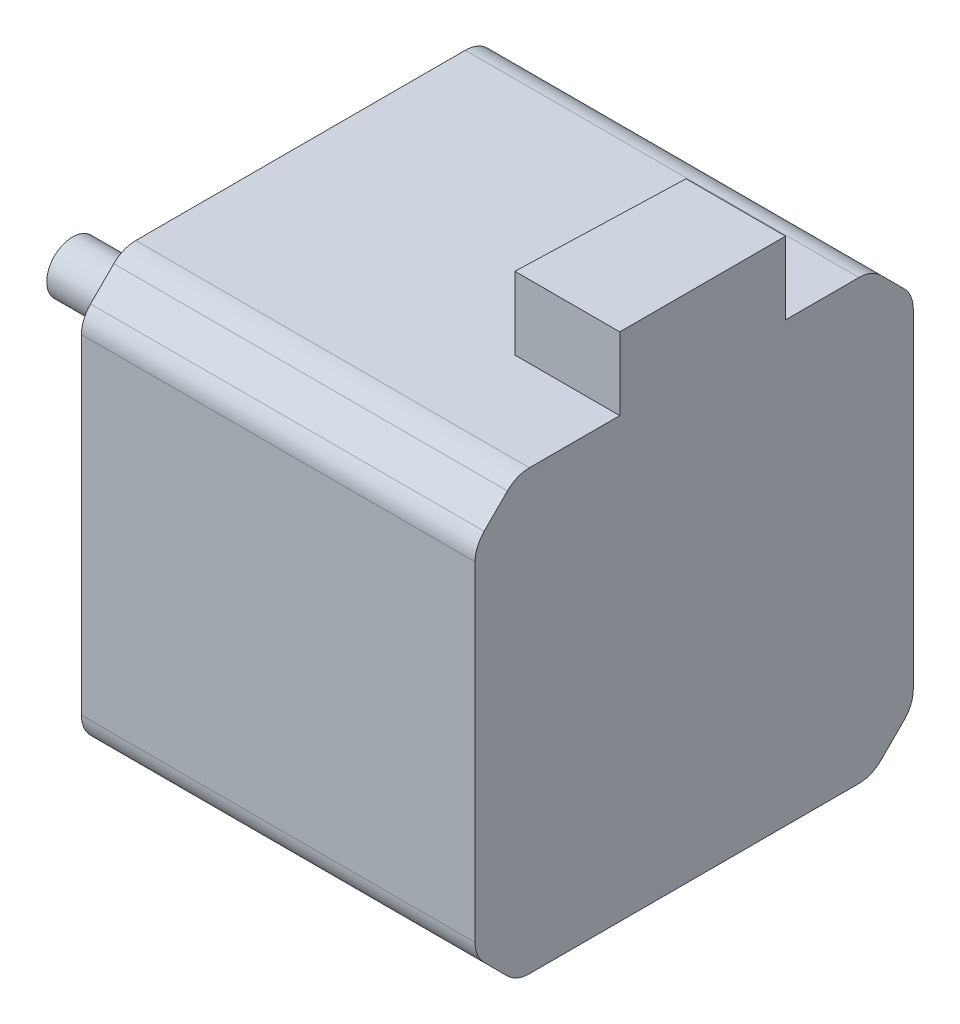
ISO-10303-21;
HEADER;
FILE_DESCRIPTION(('STEP AP214'),'2;1');
FILE_NAME('part.step','',(''),(''),'','','');
FILE_SCHEMA(('AUTOMOTIVE_DESIGN { 1 0 10303 214 1 1 1 1 }'));
ENDSEC;
DATA;
#1=APPLICATION_CONTEXT('core data for automotive mechanical design processes');
#2=APPLICATION_PROTOCOL_DEFINITION('international standard','automotive_design',2000,#1);
#3=PRODUCT_CONTEXT('',#1,'mechanical');
#4=PRODUCT('Part','Part','',(#3));
#5=PRODUCT_RELATED_PRODUCT_CATEGORY('part','',(#4));
#6=PRODUCT_DEFINITION_FORMATION('','',#4);
#7=PRODUCT_DEFINITION_CONTEXT('part definition',#1,'design');
#8=PRODUCT_DEFINITION('design','',#6,#7);
#9=PRODUCT_DEFINITION_SHAPE('','',#8);
#10=(LENGTH_UNIT() NAMED_UNIT(*) SI_UNIT(.MILLI.,.METRE.));
#11=(NAMED_UNIT(*) PLANE_ANGLE_UNIT() SI_UNIT($,.RADIAN.));
#12=(NAMED_UNIT(*) SI_UNIT($,.STERADIAN.) SOLID_ANGLE_UNIT());
#13=UNCERTAINTY_MEASURE_WITH_UNIT(LENGTH_MEASURE(1.E-05),#10,'distance_accuracy_value','');
#14=(GEOMETRIC_REPRESENTATION_CONTEXT(3) GLOBAL_UNCERTAINTY_ASSIGNED_CONTEXT((#13)) GLOBAL_UNIT_ASSIGNED_CONTEXT((#10,
#11,#12)) REPRESENTATION_CONTEXT('',''));
#15=CARTESIAN_POINT('',(0.,0.,0.));
#16=DIRECTION('',(0.,0.,1.));
#17=DIRECTION('',(1.,0.,0.));
#18=AXIS2_PLACEMENT_3D('',#15,#16,#17);
#19=CARTESIAN_POINT('',(38.,42.3,-5.2426406871193));
#20=DIRECTION('',(0.,1.,0.));
#21=DIRECTION('',(0.,0.,1.));
#22=AXIS2_PLACEMENT_3D('',#19,#20,#21);
#23=PLANE('',#22);
#24=DIRECTION('',(-0.032942464499696,0.,0.999457249727414));
#25=VECTOR('',#24,1.);
#26=CARTESIAN_POINT('',(28.4,42.3,-29.967521896495));
#27=LINE('',#26,#25);
#28=CARTESIAN_POINT('',(28.4,42.3,-29.967521896495));
#29=VERTEX_POINT('',#28);
#30=CARTESIAN_POINT('',(27.8726343401492,42.3,-13.967521896495));
#31=VERTEX_POINT('',#30);
#32=EDGE_CURVE('E51',#29,#31,#27,.T.);
#33=ORIENTED_EDGE('',*,*,#32,.F.);
#34=DIRECTION('',(-1.,0.,0.));
#35=VECTOR('',#34,1.);
#36=CARTESIAN_POINT('',(28.4,42.3,-29.967521896495));
#37=LINE('',#36,#35);
#38=CARTESIAN_POINT('',(38.,42.3,-29.967521896495));
#39=VERTEX_POINT('',#38);
#40=EDGE_CURVE('E708',#39,#29,#37,.T.);
#41=ORIENTED_EDGE('',*,*,#40,.F.);
#42=DIRECTION('',(0.,0.,-1.));
#43=VECTOR('',#42,1.);
#44=CARTESIAN_POINT('',(38.,42.3,-5.2426406871193));
#45=LINE('',#44,#43);
#46=CARTESIAN_POINT('',(38.,42.3,-37.0573593128807));
#47=VERTEX_POINT('',#46);
#48=EDGE_CURVE('E195',#39,#47,#45,.T.);
#49=ORIENTED_EDGE('',*,*,#48,.T.);
#50=DIRECTION('',(-1.,0.,0.));
#51=VECTOR('',#50,1.);
#52=CARTESIAN_POINT('',(38.,42.3,-37.0573593128807));
#53=LINE('',#52,#51);
#54=CARTESIAN_POINT('',(0.,42.3,-37.0573593128807));
#55=VERTEX_POINT('',#54);
#56=EDGE_CURVE('E350',#47,#55,#53,.T.);
#57=ORIENTED_EDGE('',*,*,#56,.T.);
#58=DIRECTION('',(0.,0.,-1.));
#59=VECTOR('',#58,1.);
#60=CARTESIAN_POINT('',(0.,42.3,-5.2426406871193));
#61=LINE('',#60,#59);
#62=CARTESIAN_POINT('',(0.,42.3,-5.2426406871193));
#63=VERTEX_POINT('',#62);
#64=EDGE_CURVE('E278',#63,#55,#61,.T.);
#65=ORIENTED_EDGE('',*,*,#64,.F.);
#66=DIRECTION('',(-1.,0.,0.));
#67=VECTOR('',#66,1.);
#68=CARTESIAN_POINT('',(38.,42.3,-5.2426406871193));
#69=LINE('',#68,#67);
#70=CARTESIAN_POINT('',(38.,42.3,-5.2426406871193));
#71=VERTEX_POINT('',#70);
#72=EDGE_CURVE('E275',#71,#63,#69,.T.);
#73=ORIENTED_EDGE('',*,*,#72,.F.);
#74=CARTESIAN_POINT('',(38.,42.3,-13.967521896495));
#75=VERTEX_POINT('',#74);
#76=EDGE_CURVE('E239',#71,#75,#45,.T.);
#77=ORIENTED_EDGE('',*,*,#76,.T.);
#78=DIRECTION('',(1.,0.,0.));
#79=VECTOR('',#78,1.);
#80=CARTESIAN_POINT('',(38.,42.3,-13.967521896495));
#81=LINE('',#80,#79);
#82=EDGE_CURVE('E56',#31,#75,#81,.T.);
#83=ORIENTED_EDGE('',*,*,#82,.F.);
#84=EDGE_LOOP('',(#33,#41,#49,#57,#65,#73,#77,#83));
#85=FACE_BOUND('',#84,.T.);
#86=ADVANCED_FACE('F36',(#85),#23,.T.);
#87=CARTESIAN_POINT('',(38.,39.3,-5.24264068711928));
#88=DIRECTION('',(-1.,0.,0.));
#89=DIRECTION('',(0.,0.,1.));
#90=AXIS2_PLACEMENT_3D('',#87,#88,#89);
#91=CYLINDRICAL_SURFACE('',#90,3.);
#92=CARTESIAN_POINT('',(0.,39.3,-5.24264068711928));
#93=DIRECTION('',(-1.,0.,0.));
#94=DIRECTION('',(0.,0.,1.));
#95=AXIS2_PLACEMENT_3D('',#92,#93,#94);
#96=CIRCLE('',#95,3.);
#97=CARTESIAN_POINT('',(0.,41.4213203435596,-3.12132034355963));
#98=VERTEX_POINT('',#97);
#99=EDGE_CURVE('E234',#98,#63,#96,.T.);
#100=ORIENTED_EDGE('',*,*,#99,.F.);
#101=DIRECTION('',(-1.,0.,0.));
#102=VECTOR('',#101,1.);
#103=CARTESIAN_POINT('',(38.,41.4213203435596,-3.12132034355963));
#104=LINE('',#103,#102);
#105=CARTESIAN_POINT('',(38.,41.4213203435596,-3.12132034355963));
#106=VERTEX_POINT('',#105);
#107=EDGE_CURVE('E318',#106,#98,#104,.T.);
#108=ORIENTED_EDGE('',*,*,#107,.F.);
#109=CARTESIAN_POINT('',(38.,39.3,-5.24264068711928));
#110=DIRECTION('',(-1.,0.,0.));
#111=DIRECTION('',(0.,0.,1.));
#112=AXIS2_PLACEMENT_3D('',#109,#110,#111);
#113=CIRCLE('',#112,3.);
#114=EDGE_CURVE('E235',#106,#71,#113,.T.);
#115=ORIENTED_EDGE('',*,*,#114,.T.);
#116=ORIENTED_EDGE('',*,*,#72,.T.);
#117=EDGE_LOOP('',(#100,#108,#115,#116));
#118=FACE_BOUND('',#117,.T.);
#119=ADVANCED_FACE('F372',(#118),#91,.T.);
#120=CARTESIAN_POINT('',(38.,39.1786796564404,-0.878679656440368));
#121=DIRECTION('',(0.,0.707106781186548,0.707106781186547));
#122=DIRECTION('',(0.,-0.707106781186547,0.707106781186548));
#123=AXIS2_PLACEMENT_3D('',#120,#121,#122);
#124=PLANE('',#123);
#125=DIRECTION('',(0.,0.707106781186547,-0.707106781186548));
#126=VECTOR('',#125,1.);
#127=CARTESIAN_POINT('',(0.,39.1786796564404,-0.878679656440368));
#128=LINE('',#127,#126);
#129=CARTESIAN_POINT('',(0.,39.1786796564404,-0.878679656440369));
#130=VERTEX_POINT('',#129);
#131=EDGE_CURVE('E238',#130,#98,#128,.T.);
#132=ORIENTED_EDGE('',*,*,#131,.F.);
#133=DIRECTION('',(-1.,0.,0.));
#134=VECTOR('',#133,1.);
#135=CARTESIAN_POINT('',(38.,39.1786796564404,-0.878679656440369));
#136=LINE('',#135,#134);
#137=CARTESIAN_POINT('',(38.,39.1786796564404,-0.878679656440369));
#138=VERTEX_POINT('',#137);
#139=EDGE_CURVE('E320',#138,#130,#136,.T.);
#140=ORIENTED_EDGE('',*,*,#139,.F.);
#141=DIRECTION('',(0.,0.707106781186547,-0.707106781186548));
#142=VECTOR('',#141,1.);
#143=CARTESIAN_POINT('',(38.,39.1786796564404,-0.878679656440368));
#144=LINE('',#143,#142);
#145=EDGE_CURVE('E272',#138,#106,#144,.T.);
#146=ORIENTED_EDGE('',*,*,#145,.T.);
#147=ORIENTED_EDGE('',*,*,#107,.T.);
#148=EDGE_LOOP('',(#132,#140,#146,#147));
#149=FACE_BOUND('',#148,.T.);
#150=ADVANCED_FACE('F377',(#149),#124,.T.);
#151=CARTESIAN_POINT('',(38.,37.0573593128807,-3.));
#152=DIRECTION('',(-1.,0.,0.));
#153=DIRECTION('',(0.,0.,1.));
#154=AXIS2_PLACEMENT_3D('',#151,#152,#153);
#155=CYLINDRICAL_SURFACE('',#154,3.);
#156=CARTESIAN_POINT('',(0.,37.0573593128807,-3.));
#157=DIRECTION('',(1.,0.,0.));
#158=DIRECTION('',(0.,0.,-1.));
#159=AXIS2_PLACEMENT_3D('',#156,#157,#158);
#160=CIRCLE('',#159,3.);
#161=CARTESIAN_POINT('',(0.,37.0573593128807,0.));
#162=VERTEX_POINT('',#161);
#163=EDGE_CURVE('E313',#130,#162,#160,.T.);
#164=ORIENTED_EDGE('',*,*,#163,.T.);
#165=DIRECTION('',(-1.,0.,0.));
#166=VECTOR('',#165,1.);
#167=CARTESIAN_POINT('',(38.,37.0573593128807,0.));
#168=LINE('',#167,#166);
#169=CARTESIAN_POINT('',(38.,37.0573593128807,0.));
#170=VERTEX_POINT('',#169);
#171=EDGE_CURVE('E322',#170,#162,#168,.T.);
#172=ORIENTED_EDGE('',*,*,#171,.F.);
#173=CARTESIAN_POINT('',(38.,37.0573593128807,-3.));
#174=DIRECTION('',(1.,0.,0.));
#175=DIRECTION('',(0.,0.,-1.));
#176=AXIS2_PLACEMENT_3D('',#173,#174,#175);
#177=CIRCLE('',#176,3.);
#178=EDGE_CURVE('E270',#138,#170,#177,.T.);
#179=ORIENTED_EDGE('',*,*,#178,.F.);
#180=ORIENTED_EDGE('',*,*,#139,.T.);
#181=EDGE_LOOP('',(#164,#172,#179,#180));
#182=FACE_BOUND('',#181,.T.);
#183=ADVANCED_FACE('F427',(#182),#155,.T.);
#184=CARTESIAN_POINT('',(38.,5.2426406871193,0.));
#185=DIRECTION('',(0.,0.,1.));
#186=DIRECTION('',(1.,0.,0.));
#187=AXIS2_PLACEMENT_3D('',#184,#185,#186);
#188=PLANE('',#187);
#189=DIRECTION('',(0.,1.,0.));
#190=VECTOR('',#189,1.);
#191=CARTESIAN_POINT('',(0.,5.2426406871193,0.));
#192=LINE('',#191,#190);
#193=CARTESIAN_POINT('',(0.,5.24264068711928,0.));
#194=VERTEX_POINT('',#193);
#195=EDGE_CURVE('E310',#194,#162,#192,.T.);
#196=ORIENTED_EDGE('',*,*,#195,.F.);
#197=DIRECTION('',(-1.,0.,0.));
#198=VECTOR('',#197,1.);
#199=CARTESIAN_POINT('',(38.,5.24264068711928,0.));
#200=LINE('',#199,#198);
#201=CARTESIAN_POINT('',(38.,5.24264068711928,0.));
#202=VERTEX_POINT('',#201);
#203=EDGE_CURVE('E324',#202,#194,#200,.T.);
#204=ORIENTED_EDGE('',*,*,#203,.F.);
#205=DIRECTION('',(0.,1.,0.));
#206=VECTOR('',#205,1.);
#207=CARTESIAN_POINT('',(38.,5.2426406871193,0.));
#208=LINE('',#207,#206);
#209=EDGE_CURVE('E267',#202,#170,#208,.T.);
#210=ORIENTED_EDGE('',*,*,#209,.T.);
#211=ORIENTED_EDGE('',*,*,#171,.T.);
#212=EDGE_LOOP('',(#196,#204,#210,#211));
#213=FACE_BOUND('',#212,.T.);
#214=ADVANCED_FACE('F423',(#213),#188,.T.);
#215=CARTESIAN_POINT('',(38.,5.24264068711928,-3.));
#216=DIRECTION('',(-1.,0.,0.));
#217=DIRECTION('',(0.,0.,1.));
#218=AXIS2_PLACEMENT_3D('',#215,#216,#217);
#219=CYLINDRICAL_SURFACE('',#218,3.);
#220=CARTESIAN_POINT('',(0.,5.24264068711928,-3.));
#221=DIRECTION('',(-1.,0.,0.));
#222=DIRECTION('',(0.,0.,1.));
#223=AXIS2_PLACEMENT_3D('',#220,#221,#222);
#224=CIRCLE('',#223,3.);
#225=CARTESIAN_POINT('',(0.,3.12132034355963,-0.878679656440366));
#226=VERTEX_POINT('',#225);
#227=EDGE_CURVE('E307',#226,#194,#224,.T.);
#228=ORIENTED_EDGE('',*,*,#227,.F.);
#229=DIRECTION('',(-1.,0.,0.));
#230=VECTOR('',#229,1.);
#231=CARTESIAN_POINT('',(38.,3.12132034355963,-0.878679656440366));
#232=LINE('',#231,#230);
#233=CARTESIAN_POINT('',(38.,3.12132034355963,-0.878679656440366));
#234=VERTEX_POINT('',#233);
#235=EDGE_CURVE('E326',#234,#226,#232,.T.);
#236=ORIENTED_EDGE('',*,*,#235,.F.);
#237=CARTESIAN_POINT('',(38.,5.24264068711928,-3.));
#238=DIRECTION('',(-1.,0.,0.));
#239=DIRECTION('',(0.,0.,1.));
#240=AXIS2_PLACEMENT_3D('',#237,#238,#239);
#241=CIRCLE('',#240,3.);
#242=EDGE_CURVE('E264',#234,#202,#241,.T.);
#243=ORIENTED_EDGE('',*,*,#242,.T.);
#244=ORIENTED_EDGE('',*,*,#203,.T.);
#245=EDGE_LOOP('',(#228,#236,#243,#244));
#246=FACE_BOUND('',#245,.T.);
#247=ADVANCED_FACE('F419',(#246),#219,.T.);
#248=CARTESIAN_POINT('',(38.,3.12132034355963,-0.878679656440366));
#249=DIRECTION('',(0.,0.707106781186548,-0.707106781186548));
#250=DIRECTION('',(0.,0.707106781186548,0.707106781186548));
#251=AXIS2_PLACEMENT_3D('',#248,#249,#250);
#252=PLANE('',#251);
#253=DIRECTION('',(0.,-0.707106781186547,-0.707106781186547));
#254=VECTOR('',#253,1.);
#255=CARTESIAN_POINT('',(0.,3.12132034355963,-0.878679656440366));
#256=LINE('',#255,#254);
#257=CARTESIAN_POINT('',(0.,0.878679656440366,-3.12132034355963));
#258=VERTEX_POINT('',#257);
#259=EDGE_CURVE('E305',#226,#258,#256,.T.);
#260=ORIENTED_EDGE('',*,*,#259,.T.);
#261=DIRECTION('',(-1.,0.,0.));
#262=VECTOR('',#261,1.);
#263=CARTESIAN_POINT('',(38.,0.878679656440366,-3.12132034355963));
#264=LINE('',#263,#262);
#265=CARTESIAN_POINT('',(38.,0.878679656440366,-3.12132034355963));
#266=VERTEX_POINT('',#265);
#267=EDGE_CURVE('E328',#266,#258,#264,.T.);
#268=ORIENTED_EDGE('',*,*,#267,.F.);
#269=DIRECTION('',(0.,-0.707106781186547,-0.707106781186547));
#270=VECTOR('',#269,1.);
#271=CARTESIAN_POINT('',(38.,3.12132034355963,-0.878679656440366));
#272=LINE('',#271,#270);
#273=EDGE_CURVE('E262',#234,#266,#272,.T.);
#274=ORIENTED_EDGE('',*,*,#273,.F.);
#275=ORIENTED_EDGE('',*,*,#235,.T.);
#276=EDGE_LOOP('',(#260,#268,#274,#275));
#277=FACE_BOUND('',#276,.T.);
#278=ADVANCED_FACE('F415',(#277),#252,.F.);
#279=CARTESIAN_POINT('',(38.,3.,-5.24264068711928));
#280=DIRECTION('',(-1.,0.,0.));
#281=DIRECTION('',(0.,0.,1.));
#282=AXIS2_PLACEMENT_3D('',#279,#280,#281);
#283=CYLINDRICAL_SURFACE('',#282,3.);
#284=CARTESIAN_POINT('',(0.,3.,-5.24264068711928));
#285=DIRECTION('',(1.,0.,0.));
#286=DIRECTION('',(0.,0.,-1.));
#287=AXIS2_PLACEMENT_3D('',#284,#285,#286);
#288=CIRCLE('',#287,3.);
#289=CARTESIAN_POINT('',(0.,0.,-5.2426406871193));
#290=VERTEX_POINT('',#289);
#291=EDGE_CURVE('E303',#258,#290,#288,.T.);
#292=ORIENTED_EDGE('',*,*,#291,.T.);
#293=DIRECTION('',(-1.,0.,0.));
#294=VECTOR('',#293,1.);
#295=CARTESIAN_POINT('',(38.,0.,-5.2426406871193));
#296=LINE('',#295,#294);
#297=CARTESIAN_POINT('',(38.,0.,-5.2426406871193));
#298=VERTEX_POINT('',#297);
#299=EDGE_CURVE('E331',#298,#290,#296,.T.);
#300=ORIENTED_EDGE('',*,*,#299,.F.);
#301=CARTESIAN_POINT('',(38.,3.,-5.24264068711928));
#302=DIRECTION('',(1.,0.,0.));
#303=DIRECTION('',(0.,0.,-1.));
#304=AXIS2_PLACEMENT_3D('',#301,#302,#303);
#305=CIRCLE('',#304,3.);
#306=EDGE_CURVE('E260',#266,#298,#305,.T.);
#307=ORIENTED_EDGE('',*,*,#306,.F.);
#308=ORIENTED_EDGE('',*,*,#267,.T.);
#309=EDGE_LOOP('',(#292,#300,#307,#308));
#310=FACE_BOUND('',#309,.T.);
#311=ADVANCED_FACE('F411',(#310),#283,.T.);
#312=CARTESIAN_POINT('',(38.,0.,-5.2426406871193));
#313=DIRECTION('',(0.,1.,0.));
#314=DIRECTION('',(0.,0.,1.));
#315=AXIS2_PLACEMENT_3D('',#312,#313,#314);
#316=PLANE('',#315);
#317=DIRECTION('',(0.,0.,-1.));
#318=VECTOR('',#317,1.);
#319=CARTESIAN_POINT('',(0.,0.,-5.2426406871193));
#320=LINE('',#319,#318);
#321=CARTESIAN_POINT('',(0.,0.,-37.0573593128807));
#322=VERTEX_POINT('',#321);
#323=EDGE_CURVE('E300',#290,#322,#320,.T.);
#324=ORIENTED_EDGE('',*,*,#323,.T.);
#325=DIRECTION('',(-1.,0.,0.));
#326=VECTOR('',#325,1.);
#327=CARTESIAN_POINT('',(38.,0.,-37.0573593128807));
#328=LINE('',#327,#326);
#329=CARTESIAN_POINT('',(38.,0.,-37.0573593128807));
#330=VERTEX_POINT('',#329);
#331=EDGE_CURVE('E334',#330,#322,#328,.T.);
#332=ORIENTED_EDGE('',*,*,#331,.F.);
#333=DIRECTION('',(0.,0.,-1.));
#334=VECTOR('',#333,1.);
#335=CARTESIAN_POINT('',(38.,0.,-5.2426406871193));
#336=LINE('',#335,#334);
#337=EDGE_CURVE('E258',#298,#330,#336,.T.);
#338=ORIENTED_EDGE('',*,*,#337,.F.);
#339=ORIENTED_EDGE('',*,*,#299,.T.);
#340=EDGE_LOOP('',(#324,#332,#338,#339));
#341=FACE_BOUND('',#340,.T.);
#342=ADVANCED_FACE('F407',(#341),#316,.F.);
#343=CARTESIAN_POINT('',(38.,3.,-37.0573593128807));
#344=DIRECTION('',(-1.,0.,0.));
#345=DIRECTION('',(0.,0.,1.));
#346=AXIS2_PLACEMENT_3D('',#343,#344,#345);
#347=CYLINDRICAL_SURFACE('',#346,3.);
#348=CARTESIAN_POINT('',(0.,3.,-37.0573593128807));
#349=DIRECTION('',(-1.,0.,0.));
#350=DIRECTION('',(0.,0.,1.));
#351=AXIS2_PLACEMENT_3D('',#348,#349,#350);
#352=CIRCLE('',#351,3.);
#353=CARTESIAN_POINT('',(0.,0.878679656440368,-39.1786796564404));
#354=VERTEX_POINT('',#353);
#355=EDGE_CURVE('E297',#354,#322,#352,.T.);
#356=ORIENTED_EDGE('',*,*,#355,.F.);
#357=DIRECTION('',(-1.,0.,0.));
#358=VECTOR('',#357,1.);
#359=CARTESIAN_POINT('',(38.,0.878679656440368,-39.1786796564404));
#360=LINE('',#359,#358);
#361=CARTESIAN_POINT('',(38.,0.878679656440368,-39.1786796564404));
#362=VERTEX_POINT('',#361);
#363=EDGE_CURVE('E336',#362,#354,#360,.T.);
#364=ORIENTED_EDGE('',*,*,#363,.F.);
#365=CARTESIAN_POINT('',(38.,3.,-37.0573593128807));
#366=DIRECTION('',(-1.,0.,0.));
#367=DIRECTION('',(0.,0.,1.));
#368=AXIS2_PLACEMENT_3D('',#365,#366,#367);
#369=CIRCLE('',#368,3.);
#370=EDGE_CURVE('E255',#362,#330,#369,.T.);
#371=ORIENTED_EDGE('',*,*,#370,.T.);
#372=ORIENTED_EDGE('',*,*,#331,.T.);
#373=EDGE_LOOP('',(#356,#364,#371,#372));
#374=FACE_BOUND('',#373,.T.);
#375=ADVANCED_FACE('F403',(#374),#347,.T.);
#376=CARTESIAN_POINT('',(38.,0.878679656440368,-39.1786796564404));
#377=DIRECTION('',(0.,0.707106781186547,0.707106781186548));
#378=DIRECTION('',(0.,-0.707106781186548,0.707106781186547));
#379=AXIS2_PLACEMENT_3D('',#376,#377,#378);
#380=PLANE('',#379);
#381=DIRECTION('',(0.,0.707106781186548,-0.707106781186547));
#382=VECTOR('',#381,1.);
#383=CARTESIAN_POINT('',(0.,0.878679656440368,-39.1786796564404));
#384=LINE('',#383,#382);
#385=CARTESIAN_POINT('',(0.,3.12132034355963,-41.4213203435596));
#386=VERTEX_POINT('',#385);
#387=EDGE_CURVE('E295',#354,#386,#384,.T.);
#388=ORIENTED_EDGE('',*,*,#387,.T.);
#389=DIRECTION('',(-1.,0.,0.));
#390=VECTOR('',#389,1.);
#391=CARTESIAN_POINT('',(38.,3.12132034355963,-41.4213203435596));
#392=LINE('',#391,#390);
#393=CARTESIAN_POINT('',(38.,3.12132034355963,-41.4213203435596));
#394=VERTEX_POINT('',#393);
#395=EDGE_CURVE('E338',#394,#386,#392,.T.);
#396=ORIENTED_EDGE('',*,*,#395,.F.);
#397=DIRECTION('',(0.,0.707106781186548,-0.707106781186547));
#398=VECTOR('',#397,1.);
#399=CARTESIAN_POINT('',(38.,0.878679656440368,-39.1786796564404));
#400=LINE('',#399,#398);
#401=EDGE_CURVE('E253',#362,#394,#400,.T.);
#402=ORIENTED_EDGE('',*,*,#401,.F.);
#403=ORIENTED_EDGE('',*,*,#363,.T.);
#404=EDGE_LOOP('',(#388,#396,#402,#403));
#405=FACE_BOUND('',#404,.T.);
#406=ADVANCED_FACE('F399',(#405),#380,.F.);
#407=CARTESIAN_POINT('',(38.,5.24264068711928,-39.3));
#408=DIRECTION('',(-1.,0.,0.));
#409=DIRECTION('',(0.,0.,1.));
#410=AXIS2_PLACEMENT_3D('',#407,#408,#409);
#411=CYLINDRICAL_SURFACE('',#410,3.);
#412=CARTESIAN_POINT('',(0.,5.24264068711928,-39.3));
#413=DIRECTION('',(1.,0.,0.));
#414=DIRECTION('',(0.,0.,-1.));
#415=AXIS2_PLACEMENT_3D('',#412,#413,#414);
#416=CIRCLE('',#415,3.);
#417=CARTESIAN_POINT('',(0.,5.2426406871193,-42.3));
#418=VERTEX_POINT('',#417);
#419=EDGE_CURVE('E293',#386,#418,#416,.T.);
#420=ORIENTED_EDGE('',*,*,#419,.T.);
#421=DIRECTION('',(-1.,0.,0.));
#422=VECTOR('',#421,1.);
#423=CARTESIAN_POINT('',(38.,5.2426406871193,-42.3));
#424=LINE('',#423,#422);
#425=CARTESIAN_POINT('',(38.,5.2426406871193,-42.3));
#426=VERTEX_POINT('',#425);
#427=EDGE_CURVE('E341',#426,#418,#424,.T.);
#428=ORIENTED_EDGE('',*,*,#427,.F.);
#429=CARTESIAN_POINT('',(38.,5.24264068711928,-39.3));
#430=DIRECTION('',(1.,0.,0.));
#431=DIRECTION('',(0.,0.,-1.));
#432=AXIS2_PLACEMENT_3D('',#429,#430,#431);
#433=CIRCLE('',#432,3.);
#434=EDGE_CURVE('E251',#394,#426,#433,.T.);
#435=ORIENTED_EDGE('',*,*,#434,.F.);
#436=ORIENTED_EDGE('',*,*,#395,.T.);
#437=EDGE_LOOP('',(#420,#428,#435,#436));
#438=FACE_BOUND('',#437,.T.);
#439=ADVANCED_FACE('F395',(#438),#411,.T.);
#440=CARTESIAN_POINT('',(38.,5.2426406871193,-42.3));
#441=DIRECTION('',(0.,0.,1.));
#442=DIRECTION('',(1.,0.,0.));
#443=AXIS2_PLACEMENT_3D('',#440,#441,#442);
#444=PLANE('',#443);
#445=DIRECTION('',(0.,1.,0.));
#446=VECTOR('',#445,1.);
#447=CARTESIAN_POINT('',(0.,5.2426406871193,-42.3));
#448=LINE('',#447,#446);
#449=CARTESIAN_POINT('',(0.,37.0573593128807,-42.3));
#450=VERTEX_POINT('',#449);
#451=EDGE_CURVE('E290',#418,#450,#448,.T.);
#452=ORIENTED_EDGE('',*,*,#451,.T.);
#453=DIRECTION('',(-1.,0.,0.));
#454=VECTOR('',#453,1.);
#455=CARTESIAN_POINT('',(38.,37.0573593128807,-42.3));
#456=LINE('',#455,#454);
#457=CARTESIAN_POINT('',(38.,37.0573593128807,-42.3));
#458=VERTEX_POINT('',#457);
#459=EDGE_CURVE('E344',#458,#450,#456,.T.);
#460=ORIENTED_EDGE('',*,*,#459,.F.);
#461=DIRECTION('',(0.,1.,0.));
#462=VECTOR('',#461,1.);
#463=CARTESIAN_POINT('',(38.,5.2426406871193,-42.3));
#464=LINE('',#463,#462);
#465=EDGE_CURVE('E249',#426,#458,#464,.T.);
#466=ORIENTED_EDGE('',*,*,#465,.F.);
#467=ORIENTED_EDGE('',*,*,#427,.T.);
#468=EDGE_LOOP('',(#452,#460,#466,#467));
#469=FACE_BOUND('',#468,.T.);
#470=ADVANCED_FACE('F391',(#469),#444,.F.);
#471=CARTESIAN_POINT('',(38.,37.0573593128807,-39.3));
#472=DIRECTION('',(-1.,0.,0.));
#473=DIRECTION('',(0.,0.,1.));
#474=AXIS2_PLACEMENT_3D('',#471,#472,#473);
#475=CYLINDRICAL_SURFACE('',#474,3.);
#476=CARTESIAN_POINT('',(0.,37.0573593128807,-39.3));
#477=DIRECTION('',(-1.,0.,0.));
#478=DIRECTION('',(0.,0.,1.));
#479=AXIS2_PLACEMENT_3D('',#476,#477,#478);
#480=CIRCLE('',#479,3.);
#481=CARTESIAN_POINT('',(0.,39.1786796564404,-41.4213203435596));
#482=VERTEX_POINT('',#481);
#483=EDGE_CURVE('E287',#482,#450,#480,.T.);
#484=ORIENTED_EDGE('',*,*,#483,.F.);
#485=DIRECTION('',(-1.,0.,0.));
#486=VECTOR('',#485,1.);
#487=CARTESIAN_POINT('',(38.,39.1786796564404,-41.4213203435596));
#488=LINE('',#487,#486);
#489=CARTESIAN_POINT('',(38.,39.1786796564404,-41.4213203435596));
#490=VERTEX_POINT('',#489);
#491=EDGE_CURVE('E346',#490,#482,#488,.T.);
#492=ORIENTED_EDGE('',*,*,#491,.F.);
#493=CARTESIAN_POINT('',(38.,37.0573593128807,-39.3));
#494=DIRECTION('',(-1.,0.,0.));
#495=DIRECTION('',(0.,0.,1.));
#496=AXIS2_PLACEMENT_3D('',#493,#494,#495);
#497=CIRCLE('',#496,3.);
#498=EDGE_CURVE('E246',#490,#458,#497,.T.);
#499=ORIENTED_EDGE('',*,*,#498,.T.);
#500=ORIENTED_EDGE('',*,*,#459,.T.);
#501=EDGE_LOOP('',(#484,#492,#499,#500));
#502=FACE_BOUND('',#501,.T.);
#503=ADVANCED_FACE('F387',(#502),#475,.T.);
#504=CARTESIAN_POINT('',(38.,41.4213203435596,-39.1786796564404));
#505=DIRECTION('',(0.,0.707106781186548,-0.707106781186548));
#506=DIRECTION('',(0.,0.707106781186548,0.707106781186548));
#507=AXIS2_PLACEMENT_3D('',#504,#505,#506);
#508=PLANE('',#507);
#509=DIRECTION('',(0.,-0.707106781186547,-0.707106781186547));
#510=VECTOR('',#509,1.);
#511=CARTESIAN_POINT('',(0.,41.4213203435596,-39.1786796564404));
#512=LINE('',#511,#510);
#513=CARTESIAN_POINT('',(0.,41.4213203435596,-39.1786796564404));
#514=VERTEX_POINT('',#513);
#515=EDGE_CURVE('E284',#514,#482,#512,.T.);
#516=ORIENTED_EDGE('',*,*,#515,.F.);
#517=DIRECTION('',(-1.,0.,0.));
#518=VECTOR('',#517,1.);
#519=CARTESIAN_POINT('',(38.,41.4213203435596,-39.1786796564404));
#520=LINE('',#519,#518);
#521=CARTESIAN_POINT('',(38.,41.4213203435596,-39.1786796564404));
#522=VERTEX_POINT('',#521);
#523=EDGE_CURVE('E348',#522,#514,#520,.T.);
#524=ORIENTED_EDGE('',*,*,#523,.F.);
#525=DIRECTION('',(0.,-0.707106781186547,-0.707106781186547));
#526=VECTOR('',#525,1.);
#527=CARTESIAN_POINT('',(38.,41.4213203435596,-39.1786796564404));
#528=LINE('',#527,#526);
#529=EDGE_CURVE('E243',#522,#490,#528,.T.);
#530=ORIENTED_EDGE('',*,*,#529,.T.);
#531=ORIENTED_EDGE('',*,*,#491,.T.);
#532=EDGE_LOOP('',(#516,#524,#530,#531));
#533=FACE_BOUND('',#532,.T.);
#534=ADVANCED_FACE('F383',(#533),#508,.T.);
#535=CARTESIAN_POINT('',(38.,39.3,-37.0573593128807));
#536=DIRECTION('',(-1.,0.,0.));
#537=DIRECTION('',(0.,0.,1.));
#538=AXIS2_PLACEMENT_3D('',#535,#536,#537);
#539=CYLINDRICAL_SURFACE('',#538,3.);
#540=CARTESIAN_POINT('',(0.,39.3,-37.0573593128807));
#541=DIRECTION('',(1.,0.,0.));
#542=DIRECTION('',(0.,0.,-1.));
#543=AXIS2_PLACEMENT_3D('',#540,#541,#542);
#544=CIRCLE('',#543,3.);
#545=EDGE_CURVE('E281',#514,#55,#544,.T.);
#546=ORIENTED_EDGE('',*,*,#545,.T.);
#547=ORIENTED_EDGE('',*,*,#56,.F.);
#548=CARTESIAN_POINT('',(38.,39.3,-37.0573593128807));
#549=DIRECTION('',(1.,0.,0.));
#550=DIRECTION('',(0.,0.,-1.));
#551=AXIS2_PLACEMENT_3D('',#548,#549,#550);
#552=CIRCLE('',#551,3.);
#553=EDGE_CURVE('E241',#522,#47,#552,.T.);
#554=ORIENTED_EDGE('',*,*,#553,.F.);
#555=ORIENTED_EDGE('',*,*,#523,.T.);
#556=EDGE_LOOP('',(#546,#547,#554,#555));
#557=FACE_BOUND('',#556,.T.);
#558=ADVANCED_FACE('F380',(#557),#539,.T.);
#559=CARTESIAN_POINT('',(38.,39.3,-5.24264068711928));
#560=DIRECTION('',(-1.,0.,0.));
#561=DIRECTION('',(0.,0.,1.));
#562=AXIS2_PLACEMENT_3D('',#559,#560,#561);
#563=PLANE('',#562);
#564=ORIENTED_EDGE('',*,*,#114,.F.);
#565=ORIENTED_EDGE('',*,*,#145,.F.);
#566=ORIENTED_EDGE('',*,*,#178,.T.);
#567=ORIENTED_EDGE('',*,*,#209,.F.);
#568=ORIENTED_EDGE('',*,*,#242,.F.);
#569=ORIENTED_EDGE('',*,*,#273,.T.);
#570=ORIENTED_EDGE('',*,*,#306,.T.);
#571=ORIENTED_EDGE('',*,*,#337,.T.);
#572=ORIENTED_EDGE('',*,*,#370,.F.);
#573=ORIENTED_EDGE('',*,*,#401,.T.);
#574=ORIENTED_EDGE('',*,*,#434,.T.);
#575=ORIENTED_EDGE('',*,*,#465,.T.);
#576=ORIENTED_EDGE('',*,*,#498,.F.);
#577=ORIENTED_EDGE('',*,*,#529,.F.);
#578=ORIENTED_EDGE('',*,*,#553,.T.);
#579=ORIENTED_EDGE('',*,*,#48,.F.);
#580=DIRECTION('',(0.,-1.,0.));
#581=VECTOR('',#580,1.);
#582=CARTESIAN_POINT('',(38.,49.3,-29.967521896495));
#583=LINE('',#582,#581);
#584=CARTESIAN_POINT('',(38.,49.3,-29.967521896495));
#585=VERTEX_POINT('',#584);
#586=EDGE_CURVE('E176',#585,#39,#583,.T.);
#587=ORIENTED_EDGE('',*,*,#586,.F.);
#588=DIRECTION('',(0.,0.,-1.));
#589=VECTOR('',#588,1.);
#590=CARTESIAN_POINT('',(38.,49.3,-29.967521896495));
#591=LINE('',#590,#589);
#592=CARTESIAN_POINT('',(38.,49.3,-13.967521896495));
#593=VERTEX_POINT('',#592);
#594=EDGE_CURVE('E182',#593,#585,#591,.T.);
#595=ORIENTED_EDGE('',*,*,#594,.F.);
#596=DIRECTION('',(0.,-1.,0.));
#597=VECTOR('',#596,1.);
#598=CARTESIAN_POINT('',(38.,49.3,-13.967521896495));
#599=LINE('',#598,#597);
#600=EDGE_CURVE('E700',#593,#75,#599,.T.);
#601=ORIENTED_EDGE('',*,*,#600,.T.);
#602=ORIENTED_EDGE('',*,*,#76,.F.);
#603=EDGE_LOOP('',(#564,#565,#566,#567,#568,#569,#570,#571,#572,#573,#574,#575,#576,#577,#578,
#579,#587,#595,#601,#602));
#604=FACE_BOUND('',#603,.T.);
#605=ADVANCED_FACE('F193',(#604),#563,.F.);
#606=CARTESIAN_POINT('',(0.,39.3,-5.24264068711928));
#607=DIRECTION('',(-1.,0.,0.));
#608=DIRECTION('',(0.,0.,1.));
#609=AXIS2_PLACEMENT_3D('',#606,#607,#608);
#610=PLANE('',#609);
#611=CARTESIAN_POINT('',(0.,5.65,-5.65));
#612=DIRECTION('',(-1.,0.,0.));
#613=DIRECTION('',(0.,0.,-1.));
#614=AXIS2_PLACEMENT_3D('',#611,#612,#613);
#615=CIRCLE('',#614,1.5);
#616=CARTESIAN_POINT('',(0.,5.65,-7.15));
#617=VERTEX_POINT('',#616);
#618=EDGE_CURVE('E209',#617,#617,#615,.T.);
#619=ORIENTED_EDGE('',*,*,#618,.F.);
#620=EDGE_LOOP('',(#619));
#621=FACE_BOUND('',#620,.T.);
#622=CARTESIAN_POINT('',(0.,5.65000000000015,-36.6500000000002));
#623=DIRECTION('',(-1.,0.,0.));
#624=DIRECTION('',(0.,1.,0.));
#625=AXIS2_PLACEMENT_3D('',#622,#623,#624);
#626=CIRCLE('',#625,1.5);
#627=CARTESIAN_POINT('',(0.,7.15000000000016,-36.6500000000001));
#628=VERTEX_POINT('',#627);
#629=EDGE_CURVE('E196',#628,#628,#626,.T.);
#630=ORIENTED_EDGE('',*,*,#629,.F.);
#631=EDGE_LOOP('',(#630));
#632=FACE_BOUND('',#631,.T.);
#633=CARTESIAN_POINT('',(0.,36.6499999999999,-5.64999999999994));
#634=DIRECTION('',(-1.,0.,0.));
#635=DIRECTION('',(0.,-1.,0.));
#636=AXIS2_PLACEMENT_3D('',#633,#634,#635);
#637=CIRCLE('',#636,1.5);
#638=CARTESIAN_POINT('',(0.,35.1499999999999,-5.64999999999995));
#639=VERTEX_POINT('',#638);
#640=EDGE_CURVE('E208',#639,#639,#637,.T.);
#641=ORIENTED_EDGE('',*,*,#640,.F.);
#642=EDGE_LOOP('',(#641));
#643=FACE_BOUND('',#642,.T.);
#644=CARTESIAN_POINT('',(0.,36.65,-36.65));
#645=DIRECTION('',(-1.,0.,0.));
#646=DIRECTION('',(0.,0.,1.));
#647=AXIS2_PLACEMENT_3D('',#644,#645,#646);
#648=CIRCLE('',#647,1.5);
#649=CARTESIAN_POINT('',(0.,36.65,-35.15));
#650=VERTEX_POINT('',#649);
#651=EDGE_CURVE('E217',#650,#650,#648,.T.);
#652=ORIENTED_EDGE('',*,*,#651,.F.);
#653=EDGE_LOOP('',(#652));
#654=FACE_BOUND('',#653,.T.);
#655=CARTESIAN_POINT('',(0.,21.15,-21.15));
#656=DIRECTION('',(-1.,0.,0.));
#657=DIRECTION('',(0.,0.,1.));
#658=AXIS2_PLACEMENT_3D('',#655,#656,#657);
#659=CIRCLE('',#658,11.);
#660=CARTESIAN_POINT('',(0.,21.15,-10.15));
#661=VERTEX_POINT('',#660);
#662=EDGE_CURVE('E229',#661,#661,#659,.T.);
#663=ORIENTED_EDGE('',*,*,#662,.F.);
#664=EDGE_LOOP('',(#663));
#665=FACE_BOUND('',#664,.T.);
#666=ORIENTED_EDGE('',*,*,#99,.T.);
#667=ORIENTED_EDGE('',*,*,#64,.T.);
#668=ORIENTED_EDGE('',*,*,#545,.F.);
#669=ORIENTED_EDGE('',*,*,#515,.T.);
#670=ORIENTED_EDGE('',*,*,#483,.T.);
#671=ORIENTED_EDGE('',*,*,#451,.F.);
#672=ORIENTED_EDGE('',*,*,#419,.F.);
#673=ORIENTED_EDGE('',*,*,#387,.F.);
#674=ORIENTED_EDGE('',*,*,#355,.T.);
#675=ORIENTED_EDGE('',*,*,#323,.F.);
#676=ORIENTED_EDGE('',*,*,#291,.F.);
#677=ORIENTED_EDGE('',*,*,#259,.F.);
#678=ORIENTED_EDGE('',*,*,#227,.T.);
#679=ORIENTED_EDGE('',*,*,#195,.T.);
#680=ORIENTED_EDGE('',*,*,#163,.F.);
#681=ORIENTED_EDGE('',*,*,#131,.T.);
#682=EDGE_LOOP('',(#666,#667,#668,#669,#670,#671,#672,#673,#674,#675,#676,#677,#678,#679,#680,#681));
#683=FACE_BOUND('',#682,.T.);
#684=ADVANCED_FACE('F435',(#621,#632,#643,#654,#665,#683),#610,.T.);
#685=CARTESIAN_POINT('',(-2.,21.15,-21.15));
#686=DIRECTION('',(1.,0.,0.));
#687=DIRECTION('',(0.,0.,-1.));
#688=AXIS2_PLACEMENT_3D('',#685,#686,#687);
#689=CYLINDRICAL_SURFACE('',#688,11.);
#690=CARTESIAN_POINT('',(-1.,21.15,-21.15));
#691=DIRECTION('',(-1.,0.,0.));
#692=DIRECTION('',(0.,0.,1.));
#693=AXIS2_PLACEMENT_3D('',#690,#691,#692);
#694=CIRCLE('',#693,11.);
#695=CARTESIAN_POINT('',(-1.,21.15,-10.15));
#696=VERTEX_POINT('',#695);
#697=EDGE_CURVE('E11',#696,#696,#694,.F.);
#698=ORIENTED_EDGE('',*,*,#697,.T.);
#699=EDGE_LOOP('',(#698));
#700=FACE_BOUND('',#699,.T.);
#701=ORIENTED_EDGE('',*,*,#662,.T.);
#702=EDGE_LOOP('',(#701));
#703=FACE_BOUND('',#702,.T.);
#704=ADVANCED_FACE('F367',(#700,#703),#689,.T.);
#705=CARTESIAN_POINT('',(-2.,21.15,-21.15));
#706=DIRECTION('',(-1.,0.,0.));
#707=DIRECTION('',(0.,0.,1.));
#708=AXIS2_PLACEMENT_3D('',#705,#706,#707);
#709=PLANE('',#708);
#710=CARTESIAN_POINT('',(-2.,21.15,-21.15));
#711=DIRECTION('',(-1.,0.,0.));
#712=DIRECTION('',(0.,0.,1.));
#713=AXIS2_PLACEMENT_3D('',#710,#711,#712);
#714=CIRCLE('',#713,2.5);
#715=CARTESIAN_POINT('',(-2.,21.15,-18.65));
#716=VERTEX_POINT('',#715);
#717=EDGE_CURVE('E223',#716,#716,#714,.T.);
#718=ORIENTED_EDGE('',*,*,#717,.F.);
#719=EDGE_LOOP('',(#718));
#720=FACE_BOUND('',#719,.T.);
#721=CARTESIAN_POINT('',(-2.,21.15,-21.15));
#722=DIRECTION('',(-1.,0.,0.));
#723=DIRECTION('',(0.,0.,1.));
#724=AXIS2_PLACEMENT_3D('',#721,#722,#723);
#725=CIRCLE('',#724,10.);
#726=CARTESIAN_POINT('',(-2.,21.15,-11.15));
#727=VERTEX_POINT('',#726);
#728=EDGE_CURVE('E44',#727,#727,#725,.T.);
#729=ORIENTED_EDGE('',*,*,#728,.T.);
#730=EDGE_LOOP('',(#729));
#731=FACE_BOUND('',#730,.T.);
#732=ADVANCED_FACE('F355',(#720,#731),#709,.T.);
#733=CARTESIAN_POINT('',(-1.,21.15,-21.15));
#734=DIRECTION('',(-1.,0.,0.));
#735=DIRECTION('',(0.,0.,1.));
#736=AXIS2_PLACEMENT_3D('',#733,#734,#735);
#737=TOROIDAL_SURFACE('',#736,10.,1.);
#738=ORIENTED_EDGE('',*,*,#697,.F.);
#739=EDGE_LOOP('',(#738));
#740=FACE_BOUND('',#739,.T.);
#741=ORIENTED_EDGE('',*,*,#728,.F.);
#742=EDGE_LOOP('',(#741));
#743=FACE_BOUND('',#742,.T.);
#744=ADVANCED_FACE('F38',(#740,#743),#737,.T.);
#745=CARTESIAN_POINT('',(-22.,21.15,-21.15));
#746=DIRECTION('',(1.,0.,0.));
#747=DIRECTION('',(0.,0.,-1.));
#748=AXIS2_PLACEMENT_3D('',#745,#746,#747);
#749=CYLINDRICAL_SURFACE('',#748,2.5);
#750=CARTESIAN_POINT('',(-22.,21.15,-21.15));
#751=DIRECTION('',(-1.,0.,0.));
#752=DIRECTION('',(0.,0.,1.));
#753=AXIS2_PLACEMENT_3D('',#750,#751,#752);
#754=CIRCLE('',#753,2.5);
#755=CARTESIAN_POINT('',(-22.,21.15,-18.65));
#756=VERTEX_POINT('',#755);
#757=EDGE_CURVE('E226',#756,#756,#754,.T.);
#758=ORIENTED_EDGE('',*,*,#757,.F.);
#759=EDGE_LOOP('',(#758));
#760=FACE_BOUND('',#759,.T.);
#761=ORIENTED_EDGE('',*,*,#717,.T.);
#762=EDGE_LOOP('',(#761));
#763=FACE_BOUND('',#762,.T.);
#764=ADVANCED_FACE('F358',(#760,#763),#749,.T.);
#765=CARTESIAN_POINT('',(-22.,21.15,-21.15));
#766=DIRECTION('',(-1.,0.,0.));
#767=DIRECTION('',(0.,0.,1.));
#768=AXIS2_PLACEMENT_3D('',#765,#766,#767);
#769=PLANE('',#768);
#770=ORIENTED_EDGE('',*,*,#757,.T.);
#771=EDGE_LOOP('',(#770));
#772=FACE_BOUND('',#771,.T.);
#773=ADVANCED_FACE('F364',(#772),#769,.T.);
#774=CARTESIAN_POINT('',(4.5,36.65,-36.65));
#775=DIRECTION('',(-1.,0.,0.));
#776=DIRECTION('',(0.,0.,1.));
#777=AXIS2_PLACEMENT_3D('',#774,#775,#776);
#778=CYLINDRICAL_SURFACE('',#777,1.5);
#779=CARTESIAN_POINT('',(4.5,36.65,-36.65));
#780=DIRECTION('',(-1.,0.,0.));
#781=DIRECTION('',(0.,0.,1.));
#782=AXIS2_PLACEMENT_3D('',#779,#780,#781);
#783=CIRCLE('',#782,1.5);
#784=CARTESIAN_POINT('',(4.5,36.65,-35.15));
#785=VERTEX_POINT('',#784);
#786=EDGE_CURVE('E220',#785,#785,#783,.T.);
#787=ORIENTED_EDGE('',*,*,#786,.F.);
#788=EDGE_LOOP('',(#787));
#789=FACE_BOUND('',#788,.T.);
#790=ORIENTED_EDGE('',*,*,#651,.T.);
#791=EDGE_LOOP('',(#790));
#792=FACE_BOUND('',#791,.T.);
#793=ADVANCED_FACE('F446',(#789,#792),#778,.F.);
#794=CARTESIAN_POINT('',(4.5,36.65,-36.65));
#795=DIRECTION('',(-1.,0.,0.));
#796=DIRECTION('',(0.,0.,1.));
#797=AXIS2_PLACEMENT_3D('',#794,#795,#796);
#798=PLANE('',#797);
#799=ORIENTED_EDGE('',*,*,#786,.T.);
#800=EDGE_LOOP('',(#799));
#801=FACE_BOUND('',#800,.T.);
#802=ADVANCED_FACE('F450',(#801),#798,.T.);
#803=CARTESIAN_POINT('',(4.5,36.6499999999999,-5.64999999999994));
#804=DIRECTION('',(-1.,0.,0.));
#805=DIRECTION('',(0.,0.,1.));
#806=AXIS2_PLACEMENT_3D('',#803,#804,#805);
#807=CYLINDRICAL_SURFACE('',#806,1.5);
#808=CARTESIAN_POINT('',(4.5,36.6499999999999,-5.64999999999994));
#809=DIRECTION('',(-1.,0.,0.));
#810=DIRECTION('',(0.,-1.,0.));
#811=AXIS2_PLACEMENT_3D('',#808,#809,#810);
#812=CIRCLE('',#811,1.5);
#813=CARTESIAN_POINT('',(4.5,35.1499999999999,-5.64999999999995));
#814=VERTEX_POINT('',#813);
#815=EDGE_CURVE('E214',#814,#814,#812,.T.);
#816=ORIENTED_EDGE('',*,*,#815,.F.);
#817=EDGE_LOOP('',(#816));
#818=FACE_BOUND('',#817,.T.);
#819=ORIENTED_EDGE('',*,*,#640,.T.);
#820=EDGE_LOOP('',(#819));
#821=FACE_BOUND('',#820,.T.);
#822=ADVANCED_FACE('F454',(#818,#821),#807,.F.);
#823=CARTESIAN_POINT('',(4.5,36.6499999999999,-5.64999999999994));
#824=DIRECTION('',(-1.,0.,0.));
#825=DIRECTION('',(0.,-1.,0.));
#826=AXIS2_PLACEMENT_3D('',#823,#824,#825);
#827=PLANE('',#826);
#828=ORIENTED_EDGE('',*,*,#815,.T.);
#829=EDGE_LOOP('',(#828));
#830=FACE_BOUND('',#829,.T.);
#831=ADVANCED_FACE('F458',(#830),#827,.T.);
#832=CARTESIAN_POINT('',(4.5,5.65000000000015,-36.6500000000002));
#833=DIRECTION('',(-1.,0.,0.));
#834=DIRECTION('',(0.,0.,1.));
#835=AXIS2_PLACEMENT_3D('',#832,#833,#834);
#836=CYLINDRICAL_SURFACE('',#835,1.5);
#837=CARTESIAN_POINT('',(4.5,5.65000000000015,-36.6500000000002));
#838=DIRECTION('',(-1.,0.,0.));
#839=DIRECTION('',(0.,1.,0.));
#840=AXIS2_PLACEMENT_3D('',#837,#838,#839);
#841=CIRCLE('',#840,1.5);
#842=CARTESIAN_POINT('',(4.5,7.15000000000016,-36.6500000000001));
#843=VERTEX_POINT('',#842);
#844=EDGE_CURVE('E199',#843,#843,#841,.T.);
#845=ORIENTED_EDGE('',*,*,#844,.F.);
#846=EDGE_LOOP('',(#845));
#847=FACE_BOUND('',#846,.T.);
#848=ORIENTED_EDGE('',*,*,#629,.T.);
#849=EDGE_LOOP('',(#848));
#850=FACE_BOUND('',#849,.T.);
#851=ADVANCED_FACE('F462',(#847,#850),#836,.F.);
#852=CARTESIAN_POINT('',(4.5,5.65000000000015,-36.6500000000002));
#853=DIRECTION('',(-1.,0.,0.));
#854=DIRECTION('',(0.,1.,0.));
#855=AXIS2_PLACEMENT_3D('',#852,#853,#854);
#856=PLANE('',#855);
#857=ORIENTED_EDGE('',*,*,#844,.T.);
#858=EDGE_LOOP('',(#857));
#859=FACE_BOUND('',#858,.T.);
#860=ADVANCED_FACE('F466',(#859),#856,.T.);
#861=CARTESIAN_POINT('',(4.5,5.65,-5.65));
#862=DIRECTION('',(-1.,0.,0.));
#863=DIRECTION('',(0.,0.,1.));
#864=AXIS2_PLACEMENT_3D('',#861,#862,#863);
#865=CYLINDRICAL_SURFACE('',#864,1.5);
#866=CARTESIAN_POINT('',(4.5,5.65,-5.65));
#867=DIRECTION('',(-1.,0.,0.));
#868=DIRECTION('',(0.,0.,-1.));
#869=AXIS2_PLACEMENT_3D('',#866,#867,#868);
#870=CIRCLE('',#869,1.5);
#871=CARTESIAN_POINT('',(4.5,5.65,-7.15));
#872=VERTEX_POINT('',#871);
#873=EDGE_CURVE('E205',#872,#872,#870,.T.);
#874=ORIENTED_EDGE('',*,*,#873,.F.);
#875=EDGE_LOOP('',(#874));
#876=FACE_BOUND('',#875,.T.);
#877=ORIENTED_EDGE('',*,*,#618,.T.);
#878=EDGE_LOOP('',(#877));
#879=FACE_BOUND('',#878,.T.);
#880=ADVANCED_FACE('F470',(#876,#879),#865,.F.);
#881=CARTESIAN_POINT('',(4.5,5.65,-5.65));
#882=DIRECTION('',(-1.,0.,0.));
#883=DIRECTION('',(0.,0.,-1.));
#884=AXIS2_PLACEMENT_3D('',#881,#882,#883);
#885=PLANE('',#884);
#886=ORIENTED_EDGE('',*,*,#873,.T.);
#887=EDGE_LOOP('',(#886));
#888=FACE_BOUND('',#887,.T.);
#889=ADVANCED_FACE('F474',(#888),#885,.T.);
#890=CARTESIAN_POINT('',(28.4,49.3,-29.967521896495));
#891=DIRECTION('',(0.,0.,1.));
#892=DIRECTION('',(1.,0.,0.));
#893=AXIS2_PLACEMENT_3D('',#890,#891,#892);
#894=PLANE('',#893);
#895=ORIENTED_EDGE('',*,*,#40,.T.);
#896=DIRECTION('',(0.,-1.,0.));
#897=VECTOR('',#896,1.);
#898=CARTESIAN_POINT('',(28.4,49.3,-29.967521896495));
#899=LINE('',#898,#897);
#900=CARTESIAN_POINT('',(28.4,49.3,-29.967521896495));
#901=VERTEX_POINT('',#900);
#902=EDGE_CURVE('E178',#901,#29,#899,.T.);
#903=ORIENTED_EDGE('',*,*,#902,.F.);
#904=DIRECTION('',(-1.,0.,0.));
#905=VECTOR('',#904,1.);
#906=CARTESIAN_POINT('',(28.4,49.3,-29.967521896495));
#907=LINE('',#906,#905);
#908=EDGE_CURVE('E172',#585,#901,#907,.T.);
#909=ORIENTED_EDGE('',*,*,#908,.F.);
#910=ORIENTED_EDGE('',*,*,#586,.T.);
#911=EDGE_LOOP('',(#895,#903,#909,#910));
#912=FACE_BOUND('',#911,.T.);
#913=ADVANCED_FACE('F174',(#912),#894,.F.);
#914=CARTESIAN_POINT('',(28.4,49.3,-29.967521896495));
#915=DIRECTION('',(0.999457249727414,0.,0.032942464499696));
#916=DIRECTION('',(0.032942464499696,0.,-0.999457249727414));
#917=AXIS2_PLACEMENT_3D('',#914,#915,#916);
#918=PLANE('',#917);
#919=ORIENTED_EDGE('',*,*,#32,.T.);
#920=DIRECTION('',(0.,-1.,0.));
#921=VECTOR('',#920,1.);
#922=CARTESIAN_POINT('',(27.8726343401492,49.3,-13.967521896495));
#923=LINE('',#922,#921);
#924=CARTESIAN_POINT('',(27.8726343401492,49.3,-13.967521896495));
#925=VERTEX_POINT('',#924);
#926=EDGE_CURVE('E201',#925,#31,#923,.T.);
#927=ORIENTED_EDGE('',*,*,#926,.F.);
#928=DIRECTION('',(-0.032942464499696,0.,0.999457249727414));
#929=VECTOR('',#928,1.);
#930=CARTESIAN_POINT('',(28.4,49.3,-29.967521896495));
#931=LINE('',#930,#929);
#932=EDGE_CURVE('E181',#901,#925,#931,.T.);
#933=ORIENTED_EDGE('',*,*,#932,.F.);
#934=ORIENTED_EDGE('',*,*,#902,.T.);
#935=EDGE_LOOP('',(#919,#927,#933,#934));
#936=FACE_BOUND('',#935,.T.);
#937=ADVANCED_FACE('F481',(#936),#918,.F.);
#938=CARTESIAN_POINT('',(38.,49.3,-13.967521896495));
#939=DIRECTION('',(0.,0.,-1.));
#940=DIRECTION('',(-1.,0.,0.));
#941=AXIS2_PLACEMENT_3D('',#938,#939,#940);
#942=PLANE('',#941);
#943=ORIENTED_EDGE('',*,*,#82,.T.);
#944=ORIENTED_EDGE('',*,*,#600,.F.);
#945=DIRECTION('',(1.,0.,0.));
#946=VECTOR('',#945,1.);
#947=CARTESIAN_POINT('',(38.,49.3,-13.967521896495));
#948=LINE('',#947,#946);
#949=EDGE_CURVE('E187',#925,#593,#948,.T.);
#950=ORIENTED_EDGE('',*,*,#949,.F.);
#951=ORIENTED_EDGE('',*,*,#926,.T.);
#952=EDGE_LOOP('',(#943,#944,#950,#951));
#953=FACE_BOUND('',#952,.T.);
#954=ADVANCED_FACE('F484',(#953),#942,.F.);
#955=CARTESIAN_POINT('',(0.,49.3,0.));
#956=DIRECTION('',(0.,-1.,0.));
#957=DIRECTION('',(0.,0.,-1.));
#958=AXIS2_PLACEMENT_3D('',#955,#956,#957);
#959=PLANE('',#958);
#960=ORIENTED_EDGE('',*,*,#594,.T.);
#961=ORIENTED_EDGE('',*,*,#908,.T.);
#962=ORIENTED_EDGE('',*,*,#932,.T.);
#963=ORIENTED_EDGE('',*,*,#949,.T.);
#964=EDGE_LOOP('',(#960,#961,#962,#963));
#965=FACE_BOUND('',#964,.T.);
#966=ADVANCED_FACE('F185',(#965),#959,.F.);
#967=CLOSED_SHELL('',(#86,#119,#150,#183,#214,#247,#278,#311,#342,#375,#406,#439,#470,#503,#534,
#558,#605,#684,#704,#732,#744,#764,#773,#793,#802,#822,#831,#851,#860,#880,#889,#913,#937,#954,#966));
#968=MANIFOLD_SOLID_BREP('B2',#967);
#969=ADVANCED_BREP_SHAPE_REPRESENTATION('',(#18,#968),#14);
#970=SHAPE_DEFINITION_REPRESENTATION(#9,#969);
ENDSEC;
END-ISO-10303-21;
